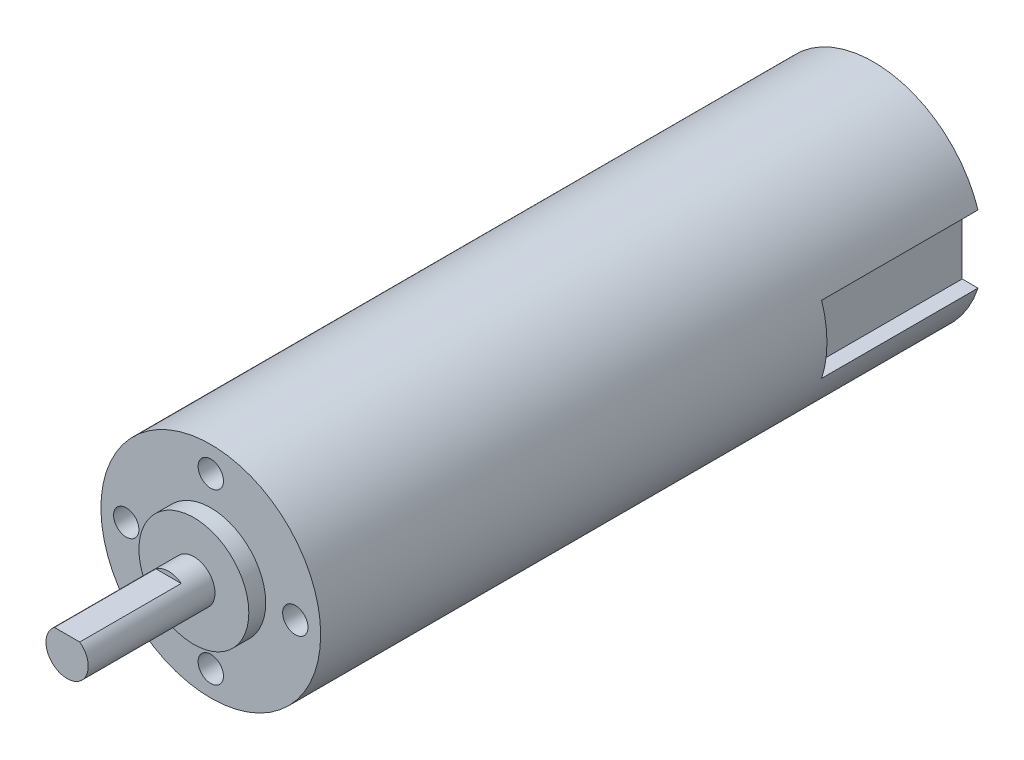
ISO-10303-21;
HEADER;
FILE_DESCRIPTION(('STEP AP214'),'2;1');
FILE_NAME('part.step','',(''),(''),'','','');
FILE_SCHEMA(('AUTOMOTIVE_DESIGN { 1 0 10303 214 1 1 1 1 }'));
ENDSEC;
DATA;
#1=APPLICATION_CONTEXT('core data for automotive mechanical design processes');
#2=APPLICATION_PROTOCOL_DEFINITION('international standard','automotive_design',2000,#1);
#3=PRODUCT_CONTEXT('',#1,'mechanical');
#4=PRODUCT('Part','Part','',(#3));
#5=PRODUCT_RELATED_PRODUCT_CATEGORY('part','',(#4));
#6=PRODUCT_DEFINITION_FORMATION('','',#4);
#7=PRODUCT_DEFINITION_CONTEXT('part definition',#1,'design');
#8=PRODUCT_DEFINITION('design','',#6,#7);
#9=PRODUCT_DEFINITION_SHAPE('','',#8);
#10=(LENGTH_UNIT() NAMED_UNIT(*) SI_UNIT(.MILLI.,.METRE.));
#11=(NAMED_UNIT(*) PLANE_ANGLE_UNIT() SI_UNIT($,.RADIAN.));
#12=(NAMED_UNIT(*) SI_UNIT($,.STERADIAN.) SOLID_ANGLE_UNIT());
#13=UNCERTAINTY_MEASURE_WITH_UNIT(LENGTH_MEASURE(1.E-05),#10,'distance_accuracy_value','');
#14=(GEOMETRIC_REPRESENTATION_CONTEXT(3) GLOBAL_UNCERTAINTY_ASSIGNED_CONTEXT((#13)) GLOBAL_UNIT_ASSIGNED_CONTEXT((#10,
#11,#12)) REPRESENTATION_CONTEXT('',''));
#15=CARTESIAN_POINT('',(0.,0.,0.));
#16=DIRECTION('',(0.,0.,1.));
#17=DIRECTION('',(1.,0.,0.));
#18=AXIS2_PLACEMENT_3D('',#15,#16,#17);
#19=CARTESIAN_POINT('',(0.,0.,78.4));
#20=DIRECTION('',(0.,0.,1.));
#21=DIRECTION('',(1.,0.,0.));
#22=AXIS2_PLACEMENT_3D('',#19,#20,#21);
#23=PLANE('',#22);
#24=CARTESIAN_POINT('',(0.,10.,78.4));
#25=DIRECTION('',(0.,0.,1.));
#26=DIRECTION('',(1.,0.,0.));
#27=AXIS2_PLACEMENT_3D('',#24,#25,#26);
#28=CIRCLE('',#27,1.5);
#29=CARTESIAN_POINT('',(1.5,10.,78.4));
#30=VERTEX_POINT('',#29);
#31=EDGE_CURVE('E142',#30,#30,#28,.T.);
#32=ORIENTED_EDGE('',*,*,#31,.F.);
#33=EDGE_LOOP('',(#32));
#34=FACE_BOUND('',#33,.T.);
#35=CARTESIAN_POINT('',(-10.,0.,78.4));
#36=DIRECTION('',(0.,0.,1.));
#37=DIRECTION('',(1.,0.,0.));
#38=AXIS2_PLACEMENT_3D('',#35,#36,#37);
#39=CIRCLE('',#38,1.5);
#40=CARTESIAN_POINT('',(-8.5,0.,78.4));
#41=VERTEX_POINT('',#40);
#42=EDGE_CURVE('E148',#41,#41,#39,.T.);
#43=ORIENTED_EDGE('',*,*,#42,.F.);
#44=EDGE_LOOP('',(#43));
#45=FACE_BOUND('',#44,.T.);
#46=CARTESIAN_POINT('',(0.,-10.,78.4));
#47=DIRECTION('',(0.,0.,1.));
#48=DIRECTION('',(1.,0.,0.));
#49=AXIS2_PLACEMENT_3D('',#46,#47,#48);
#50=CIRCLE('',#49,1.5);
#51=CARTESIAN_POINT('',(1.5,-10.,78.4));
#52=VERTEX_POINT('',#51);
#53=EDGE_CURVE('E154',#52,#52,#50,.T.);
#54=ORIENTED_EDGE('',*,*,#53,.F.);
#55=EDGE_LOOP('',(#54));
#56=FACE_BOUND('',#55,.T.);
#57=CARTESIAN_POINT('',(10.,0.,78.4));
#58=DIRECTION('',(0.,0.,1.));
#59=DIRECTION('',(1.,0.,0.));
#60=AXIS2_PLACEMENT_3D('',#57,#58,#59);
#61=CIRCLE('',#60,1.5);
#62=CARTESIAN_POINT('',(11.5,0.,78.4));
#63=VERTEX_POINT('',#62);
#64=EDGE_CURVE('E130',#63,#63,#61,.T.);
#65=ORIENTED_EDGE('',*,*,#64,.F.);
#66=EDGE_LOOP('',(#65));
#67=FACE_BOUND('',#66,.T.);
#68=CARTESIAN_POINT('',(0.,0.,78.4));
#69=DIRECTION('',(0.,0.,1.));
#70=DIRECTION('',(1.,0.,0.));
#71=AXIS2_PLACEMENT_3D('',#68,#69,#70);
#72=CIRCLE('',#71,13.);
#73=CARTESIAN_POINT('',(13.,0.,78.4));
#74=VERTEX_POINT('',#73);
#75=EDGE_CURVE('E11',#74,#74,#72,.T.);
#76=ORIENTED_EDGE('',*,*,#75,.T.);
#77=EDGE_LOOP('',(#76));
#78=FACE_BOUND('',#77,.T.);
#79=CARTESIAN_POINT('',(0.,0.,78.4));
#80=DIRECTION('',(0.,0.,1.));
#81=DIRECTION('',(1.,0.,0.));
#82=AXIS2_PLACEMENT_3D('',#79,#80,#81);
#83=CIRCLE('',#82,6.5);
#84=CARTESIAN_POINT('',(6.5,0.,78.4));
#85=VERTEX_POINT('',#84);
#86=EDGE_CURVE('E161',#85,#85,#83,.T.);
#87=ORIENTED_EDGE('',*,*,#86,.F.);
#88=EDGE_LOOP('',(#87));
#89=FACE_BOUND('',#88,.T.);
#90=ADVANCED_FACE('F37',(#34,#45,#56,#67,#78,#89),#23,.T.);
#91=CARTESIAN_POINT('',(0.,0.,78.4));
#92=DIRECTION('',(0.,0.,-1.));
#93=DIRECTION('',(-1.,0.,0.));
#94=AXIS2_PLACEMENT_3D('',#91,#92,#93);
#95=CYLINDRICAL_SURFACE('',#94,13.);
#96=CARTESIAN_POINT('',(0.,0.,18.5));
#97=DIRECTION('',(0.,0.,-1.));
#98=DIRECTION('',(-1.,0.,0.));
#99=AXIS2_PLACEMENT_3D('',#96,#97,#98);
#100=CIRCLE('',#99,13.);
#101=CARTESIAN_POINT('',(12.369316876853,4.,18.5));
#102=VERTEX_POINT('',#101);
#103=CARTESIAN_POINT('',(12.369316876853,-4.,18.5));
#104=VERTEX_POINT('',#103);
#105=EDGE_CURVE('E168',#102,#104,#100,.T.);
#106=ORIENTED_EDGE('',*,*,#105,.F.);
#107=DIRECTION('',(0.,0.,-1.));
#108=VECTOR('',#107,1.);
#109=CARTESIAN_POINT('',(12.369316876853,4.,18.5));
#110=LINE('',#109,#108);
#111=CARTESIAN_POINT('',(12.369316876853,4.,0.));
#112=VERTEX_POINT('',#111);
#113=EDGE_CURVE('E189',#102,#112,#110,.T.);
#114=ORIENTED_EDGE('',*,*,#113,.T.);
#115=CARTESIAN_POINT('',(0.,0.,0.));
#116=DIRECTION('',(0.,0.,1.));
#117=DIRECTION('',(1.,0.,0.));
#118=AXIS2_PLACEMENT_3D('',#115,#116,#117);
#119=CIRCLE('',#118,13.);
#120=CARTESIAN_POINT('',(-12.369316876853,4.,0.));
#121=VERTEX_POINT('',#120);
#122=EDGE_CURVE('E41',#112,#121,#119,.T.);
#123=ORIENTED_EDGE('',*,*,#122,.T.);
#124=DIRECTION('',(0.,0.,-1.));
#125=VECTOR('',#124,1.);
#126=CARTESIAN_POINT('',(-12.369316876853,4.,18.5));
#127=LINE('',#126,#125);
#128=CARTESIAN_POINT('',(-12.369316876853,4.,18.5));
#129=VERTEX_POINT('',#128);
#130=EDGE_CURVE('E216',#129,#121,#127,.T.);
#131=ORIENTED_EDGE('',*,*,#130,.F.);
#132=CARTESIAN_POINT('',(0.,0.,18.5));
#133=DIRECTION('',(0.,0.,-1.));
#134=DIRECTION('',(1.,0.,0.));
#135=AXIS2_PLACEMENT_3D('',#132,#133,#134);
#136=CIRCLE('',#135,13.);
#137=CARTESIAN_POINT('',(-12.3650078174607,-4.01330059603498,18.5));
#138=VERTEX_POINT('',#137);
#139=EDGE_CURVE('E204',#138,#129,#136,.T.);
#140=ORIENTED_EDGE('',*,*,#139,.F.);
#141=DIRECTION('',(0.,0.,-1.));
#142=VECTOR('',#141,1.);
#143=CARTESIAN_POINT('',(-12.3650078174607,-4.01330059603498,18.5));
#144=LINE('',#143,#142);
#145=CARTESIAN_POINT('',(-12.3650078174607,-4.01330059603498,0.));
#146=VERTEX_POINT('',#145);
#147=EDGE_CURVE('E218',#138,#146,#144,.T.);
#148=ORIENTED_EDGE('',*,*,#147,.T.);
#149=CARTESIAN_POINT('',(12.369316876853,-4.,0.));
#150=VERTEX_POINT('',#149);
#151=EDGE_CURVE('E222',#146,#150,#119,.T.);
#152=ORIENTED_EDGE('',*,*,#151,.T.);
#153=DIRECTION('',(0.,0.,-1.));
#154=VECTOR('',#153,1.);
#155=CARTESIAN_POINT('',(12.369316876853,-4.,18.5));
#156=LINE('',#155,#154);
#157=EDGE_CURVE('E180',#104,#150,#156,.T.);
#158=ORIENTED_EDGE('',*,*,#157,.F.);
#159=EDGE_LOOP('',(#106,#114,#123,#131,#140,#148,#152,#158));
#160=FACE_BOUND('',#159,.T.);
#161=ORIENTED_EDGE('',*,*,#75,.F.);
#162=EDGE_LOOP('',(#161));
#163=FACE_BOUND('',#162,.T.);
#164=ADVANCED_FACE('F39',(#160,#163),#95,.T.);
#165=CARTESIAN_POINT('',(0.,0.,0.));
#166=DIRECTION('',(0.,0.,1.));
#167=DIRECTION('',(1.,0.,0.));
#168=AXIS2_PLACEMENT_3D('',#165,#166,#167);
#169=PLANE('',#168);
#170=ORIENTED_EDGE('',*,*,#122,.F.);
#171=DIRECTION('',(1.,0.,0.));
#172=VECTOR('',#171,1.);
#173=CARTESIAN_POINT('',(10.5,4.,0.));
#174=LINE('',#173,#172);
#175=CARTESIAN_POINT('',(10.5,4.,0.));
#176=VERTEX_POINT('',#175);
#177=EDGE_CURVE('E172',#176,#112,#174,.T.);
#178=ORIENTED_EDGE('',*,*,#177,.F.);
#179=DIRECTION('',(0.,1.,0.));
#180=VECTOR('',#179,1.);
#181=CARTESIAN_POINT('',(10.5,0.,0.));
#182=LINE('',#181,#180);
#183=CARTESIAN_POINT('',(10.5,-4.,0.));
#184=VERTEX_POINT('',#183);
#185=EDGE_CURVE('E184',#184,#176,#182,.T.);
#186=ORIENTED_EDGE('',*,*,#185,.F.);
#187=DIRECTION('',(-1.,0.,0.));
#188=VECTOR('',#187,1.);
#189=CARTESIAN_POINT('',(10.5,-4.,0.));
#190=LINE('',#189,#188);
#191=EDGE_CURVE('E181',#150,#184,#190,.T.);
#192=ORIENTED_EDGE('',*,*,#191,.F.);
#193=ORIENTED_EDGE('',*,*,#151,.F.);
#194=DIRECTION('',(-0.999974570704306,-0.00713147563547531,0.));
#195=VECTOR('',#194,1.);
#196=CARTESIAN_POINT('',(-10.5,-4.,0.));
#197=LINE('',#196,#195);
#198=CARTESIAN_POINT('',(-10.5,-4.,0.));
#199=VERTEX_POINT('',#198);
#200=EDGE_CURVE('E165',#199,#146,#197,.T.);
#201=ORIENTED_EDGE('',*,*,#200,.F.);
#202=DIRECTION('',(0.,-1.,0.));
#203=VECTOR('',#202,1.);
#204=CARTESIAN_POINT('',(-10.5,0.,0.));
#205=LINE('',#204,#203);
#206=CARTESIAN_POINT('',(-10.5,4.,0.));
#207=VERTEX_POINT('',#206);
#208=EDGE_CURVE('E201',#207,#199,#205,.T.);
#209=ORIENTED_EDGE('',*,*,#208,.F.);
#210=DIRECTION('',(1.,0.,0.));
#211=VECTOR('',#210,1.);
#212=CARTESIAN_POINT('',(-10.5,4.,0.));
#213=LINE('',#212,#211);
#214=EDGE_CURVE('E211',#121,#207,#213,.T.);
#215=ORIENTED_EDGE('',*,*,#214,.F.);
#216=EDGE_LOOP('',(#170,#178,#186,#192,#193,#201,#209,#215));
#217=FACE_BOUND('',#216,.T.);
#218=ADVANCED_FACE('F237',(#217),#169,.F.);
#219=CARTESIAN_POINT('',(-10.5,0.,18.5));
#220=DIRECTION('',(1.,0.,0.));
#221=DIRECTION('',(0.,0.,-1.));
#222=AXIS2_PLACEMENT_3D('',#219,#220,#221);
#223=PLANE('',#222);
#224=ORIENTED_EDGE('',*,*,#208,.T.);
#225=DIRECTION('',(0.,0.,-1.));
#226=VECTOR('',#225,1.);
#227=CARTESIAN_POINT('',(-10.5,-4.,18.5));
#228=LINE('',#227,#226);
#229=CARTESIAN_POINT('',(-10.5,-4.,18.5));
#230=VERTEX_POINT('',#229);
#231=EDGE_CURVE('E60',#230,#199,#228,.T.);
#232=ORIENTED_EDGE('',*,*,#231,.F.);
#233=DIRECTION('',(0.,-1.,0.));
#234=VECTOR('',#233,1.);
#235=CARTESIAN_POINT('',(-10.5,0.,18.5));
#236=LINE('',#235,#234);
#237=CARTESIAN_POINT('',(-10.5,4.,18.5));
#238=VERTEX_POINT('',#237);
#239=EDGE_CURVE('E197',#238,#230,#236,.T.);
#240=ORIENTED_EDGE('',*,*,#239,.F.);
#241=DIRECTION('',(0.,0.,-1.));
#242=VECTOR('',#241,1.);
#243=CARTESIAN_POINT('',(-10.5,4.,18.5));
#244=LINE('',#243,#242);
#245=EDGE_CURVE('E185',#238,#207,#244,.T.);
#246=ORIENTED_EDGE('',*,*,#245,.T.);
#247=EDGE_LOOP('',(#224,#232,#240,#246));
#248=FACE_BOUND('',#247,.T.);
#249=ADVANCED_FACE('F277',(#248),#223,.F.);
#250=CARTESIAN_POINT('',(-10.5,4.,18.5));
#251=DIRECTION('',(0.,1.,0.));
#252=DIRECTION('',(-1.,0.,0.));
#253=AXIS2_PLACEMENT_3D('',#250,#251,#252);
#254=PLANE('',#253);
#255=ORIENTED_EDGE('',*,*,#214,.T.);
#256=ORIENTED_EDGE('',*,*,#245,.F.);
#257=DIRECTION('',(1.,0.,0.));
#258=VECTOR('',#257,1.);
#259=CARTESIAN_POINT('',(-10.5,4.,18.5));
#260=LINE('',#259,#258);
#261=EDGE_CURVE('E207',#129,#238,#260,.T.);
#262=ORIENTED_EDGE('',*,*,#261,.F.);
#263=ORIENTED_EDGE('',*,*,#130,.T.);
#264=EDGE_LOOP('',(#255,#256,#262,#263));
#265=FACE_BOUND('',#264,.T.);
#266=ADVANCED_FACE('F243',(#265),#254,.F.);
#267=CARTESIAN_POINT('',(-10.5,-4.,18.5));
#268=DIRECTION('',(0.00713147563547531,-0.999974570704306,0.));
#269=DIRECTION('',(0.999974570704306,0.00713147563547531,0.));
#270=AXIS2_PLACEMENT_3D('',#267,#268,#269);
#271=PLANE('',#270);
#272=ORIENTED_EDGE('',*,*,#200,.T.);
#273=ORIENTED_EDGE('',*,*,#147,.F.);
#274=DIRECTION('',(-0.999974570704306,-0.00713147563547531,0.));
#275=VECTOR('',#274,1.);
#276=CARTESIAN_POINT('',(-10.5,-4.,18.5));
#277=LINE('',#276,#275);
#278=EDGE_CURVE('E200',#230,#138,#277,.T.);
#279=ORIENTED_EDGE('',*,*,#278,.F.);
#280=ORIENTED_EDGE('',*,*,#231,.T.);
#281=EDGE_LOOP('',(#272,#273,#279,#280));
#282=FACE_BOUND('',#281,.T.);
#283=ADVANCED_FACE('F286',(#282),#271,.F.);
#284=CARTESIAN_POINT('',(0.,0.,18.5));
#285=DIRECTION('',(0.,0.,1.));
#286=DIRECTION('',(1.,0.,0.));
#287=AXIS2_PLACEMENT_3D('',#284,#285,#286);
#288=PLANE('',#287);
#289=ORIENTED_EDGE('',*,*,#239,.T.);
#290=ORIENTED_EDGE('',*,*,#278,.T.);
#291=ORIENTED_EDGE('',*,*,#139,.T.);
#292=ORIENTED_EDGE('',*,*,#261,.T.);
#293=EDGE_LOOP('',(#289,#290,#291,#292));
#294=FACE_BOUND('',#293,.T.);
#295=ADVANCED_FACE('F245',(#294),#288,.F.);
#296=CARTESIAN_POINT('',(10.5,4.,18.5));
#297=DIRECTION('',(0.,1.,0.));
#298=DIRECTION('',(0.,0.,1.));
#299=AXIS2_PLACEMENT_3D('',#296,#297,#298);
#300=PLANE('',#299);
#301=ORIENTED_EDGE('',*,*,#177,.T.);
#302=ORIENTED_EDGE('',*,*,#113,.F.);
#303=DIRECTION('',(1.,0.,0.));
#304=VECTOR('',#303,1.);
#305=CARTESIAN_POINT('',(10.5,4.,18.5));
#306=LINE('',#305,#304);
#307=CARTESIAN_POINT('',(10.5,4.,18.5));
#308=VERTEX_POINT('',#307);
#309=EDGE_CURVE('E177',#308,#102,#306,.T.);
#310=ORIENTED_EDGE('',*,*,#309,.F.);
#311=DIRECTION('',(0.,0.,-1.));
#312=VECTOR('',#311,1.);
#313=CARTESIAN_POINT('',(10.5,4.,18.5));
#314=LINE('',#313,#312);
#315=EDGE_CURVE('E192',#308,#176,#314,.T.);
#316=ORIENTED_EDGE('',*,*,#315,.T.);
#317=EDGE_LOOP('',(#301,#302,#310,#316));
#318=FACE_BOUND('',#317,.T.);
#319=ADVANCED_FACE('F255',(#318),#300,.F.);
#320=CARTESIAN_POINT('',(10.5,0.,18.5));
#321=DIRECTION('',(-1.,0.,0.));
#322=DIRECTION('',(0.,0.,1.));
#323=AXIS2_PLACEMENT_3D('',#320,#321,#322);
#324=PLANE('',#323);
#325=ORIENTED_EDGE('',*,*,#185,.T.);
#326=ORIENTED_EDGE('',*,*,#315,.F.);
#327=DIRECTION('',(0.,1.,0.));
#328=VECTOR('',#327,1.);
#329=CARTESIAN_POINT('',(10.5,0.,18.5));
#330=LINE('',#329,#328);
#331=CARTESIAN_POINT('',(10.5,-4.,18.5));
#332=VERTEX_POINT('',#331);
#333=EDGE_CURVE('E175',#332,#308,#330,.T.);
#334=ORIENTED_EDGE('',*,*,#333,.F.);
#335=DIRECTION('',(0.,0.,-1.));
#336=VECTOR('',#335,1.);
#337=CARTESIAN_POINT('',(10.5,-4.,18.5));
#338=LINE('',#337,#336);
#339=EDGE_CURVE('E194',#332,#184,#338,.T.);
#340=ORIENTED_EDGE('',*,*,#339,.T.);
#341=EDGE_LOOP('',(#325,#326,#334,#340));
#342=FACE_BOUND('',#341,.T.);
#343=ADVANCED_FACE('F257',(#342),#324,.F.);
#344=CARTESIAN_POINT('',(10.5,-4.,18.5));
#345=DIRECTION('',(0.,-1.,0.));
#346=DIRECTION('',(0.,0.,-1.));
#347=AXIS2_PLACEMENT_3D('',#344,#345,#346);
#348=PLANE('',#347);
#349=ORIENTED_EDGE('',*,*,#191,.T.);
#350=ORIENTED_EDGE('',*,*,#339,.F.);
#351=DIRECTION('',(-1.,0.,0.));
#352=VECTOR('',#351,1.);
#353=CARTESIAN_POINT('',(10.5,-4.,18.5));
#354=LINE('',#353,#352);
#355=EDGE_CURVE('E171',#104,#332,#354,.T.);
#356=ORIENTED_EDGE('',*,*,#355,.F.);
#357=ORIENTED_EDGE('',*,*,#157,.T.);
#358=EDGE_LOOP('',(#349,#350,#356,#357));
#359=FACE_BOUND('',#358,.T.);
#360=ADVANCED_FACE('F248',(#359),#348,.F.);
#361=CARTESIAN_POINT('',(0.,0.,18.5));
#362=DIRECTION('',(0.,0.,-1.));
#363=DIRECTION('',(-1.,0.,0.));
#364=AXIS2_PLACEMENT_3D('',#361,#362,#363);
#365=PLANE('',#364);
#366=ORIENTED_EDGE('',*,*,#105,.T.);
#367=ORIENTED_EDGE('',*,*,#355,.T.);
#368=ORIENTED_EDGE('',*,*,#333,.T.);
#369=ORIENTED_EDGE('',*,*,#309,.T.);
#370=EDGE_LOOP('',(#366,#367,#368,#369));
#371=FACE_BOUND('',#370,.T.);
#372=ADVANCED_FACE('F251',(#371),#365,.T.);
#373=CARTESIAN_POINT('',(0.,0.,80.4));
#374=DIRECTION('',(0.,0.,1.));
#375=DIRECTION('',(1.,0.,0.));
#376=AXIS2_PLACEMENT_3D('',#373,#374,#375);
#377=PLANE('',#376);
#378=CARTESIAN_POINT('',(0.,0.,80.4));
#379=DIRECTION('',(0.,0.,1.));
#380=DIRECTION('',(1.,0.,0.));
#381=AXIS2_PLACEMENT_3D('',#378,#379,#380);
#382=CIRCLE('',#381,6.5);
#383=CARTESIAN_POINT('',(6.5,0.,80.4));
#384=VERTEX_POINT('',#383);
#385=EDGE_CURVE('E162',#384,#384,#382,.T.);
#386=ORIENTED_EDGE('',*,*,#385,.T.);
#387=EDGE_LOOP('',(#386));
#388=FACE_BOUND('',#387,.T.);
#389=CARTESIAN_POINT('',(0.,0.,80.4));
#390=DIRECTION('',(0.,0.,1.));
#391=DIRECTION('',(1.,0.,0.));
#392=AXIS2_PLACEMENT_3D('',#389,#390,#391);
#393=CIRCLE('',#392,2.5);
#394=CARTESIAN_POINT('',(2.5,0.,80.4));
#395=VERTEX_POINT('',#394);
#396=EDGE_CURVE('E141',#395,#395,#393,.T.);
#397=ORIENTED_EDGE('',*,*,#396,.F.);
#398=EDGE_LOOP('',(#397));
#399=FACE_BOUND('',#398,.T.);
#400=ADVANCED_FACE('F299',(#388,#399),#377,.T.);
#401=CARTESIAN_POINT('',(0.,0.,80.4));
#402=DIRECTION('',(0.,0.,-1.));
#403=DIRECTION('',(-1.,0.,0.));
#404=AXIS2_PLACEMENT_3D('',#401,#402,#403);
#405=CYLINDRICAL_SURFACE('',#404,6.5);
#406=ORIENTED_EDGE('',*,*,#385,.F.);
#407=EDGE_LOOP('',(#406));
#408=FACE_BOUND('',#407,.T.);
#409=ORIENTED_EDGE('',*,*,#86,.T.);
#410=EDGE_LOOP('',(#409));
#411=FACE_BOUND('',#410,.T.);
#412=ADVANCED_FACE('F293',(#408,#411),#405,.T.);
#413=CARTESIAN_POINT('',(0.,0.,95.4));
#414=DIRECTION('',(0.,0.,1.));
#415=DIRECTION('',(1.,0.,0.));
#416=AXIS2_PLACEMENT_3D('',#413,#414,#415);
#417=PLANE('',#416);
#418=DIRECTION('',(1.,0.,0.));
#419=VECTOR('',#418,1.);
#420=CARTESIAN_POINT('',(0.,2.,95.4));
#421=LINE('',#420,#419);
#422=CARTESIAN_POINT('',(-1.5,2.,95.4));
#423=VERTEX_POINT('',#422);
#424=CARTESIAN_POINT('',(1.5,2.,95.4));
#425=VERTEX_POINT('',#424);
#426=EDGE_CURVE('E120',#423,#425,#421,.T.);
#427=ORIENTED_EDGE('',*,*,#426,.F.);
#428=CARTESIAN_POINT('',(0.,0.,95.4));
#429=DIRECTION('',(0.,0.,1.));
#430=DIRECTION('',(1.,0.,0.));
#431=AXIS2_PLACEMENT_3D('',#428,#429,#430);
#432=CIRCLE('',#431,2.5);
#433=EDGE_CURVE('E129',#423,#425,#432,.T.);
#434=ORIENTED_EDGE('',*,*,#433,.T.);
#435=EDGE_LOOP('',(#427,#434));
#436=FACE_BOUND('',#435,.T.);
#437=ADVANCED_FACE('F291',(#436),#417,.T.);
#438=CARTESIAN_POINT('',(0.,0.,95.4));
#439=DIRECTION('',(0.,0.,-1.));
#440=DIRECTION('',(-1.,0.,0.));
#441=AXIS2_PLACEMENT_3D('',#438,#439,#440);
#442=CYLINDRICAL_SURFACE('',#441,2.5);
#443=ORIENTED_EDGE('',*,*,#433,.F.);
#444=DIRECTION('',(0.,0.,1.));
#445=VECTOR('',#444,1.);
#446=CARTESIAN_POINT('',(-1.5,2.,83.4));
#447=LINE('',#446,#445);
#448=CARTESIAN_POINT('',(-1.5,2.,83.4));
#449=VERTEX_POINT('',#448);
#450=EDGE_CURVE('E115',#449,#423,#447,.T.);
#451=ORIENTED_EDGE('',*,*,#450,.F.);
#452=CARTESIAN_POINT('',(0.,0.,83.4));
#453=DIRECTION('',(0.,0.,1.));
#454=DIRECTION('',(-1.,0.,0.));
#455=AXIS2_PLACEMENT_3D('',#452,#453,#454);
#456=CIRCLE('',#455,2.5);
#457=CARTESIAN_POINT('',(1.5,2.,83.4));
#458=VERTEX_POINT('',#457);
#459=EDGE_CURVE('E119',#458,#449,#456,.T.);
#460=ORIENTED_EDGE('',*,*,#459,.F.);
#461=DIRECTION('',(0.,0.,1.));
#462=VECTOR('',#461,1.);
#463=CARTESIAN_POINT('',(1.5,2.,83.4));
#464=LINE('',#463,#462);
#465=EDGE_CURVE('E52',#458,#425,#464,.T.);
#466=ORIENTED_EDGE('',*,*,#465,.T.);
#467=EDGE_LOOP('',(#443,#451,#460,#466));
#468=FACE_BOUND('',#467,.T.);
#469=ORIENTED_EDGE('',*,*,#396,.T.);
#470=EDGE_LOOP('',(#469));
#471=FACE_BOUND('',#470,.T.);
#472=ADVANCED_FACE('F126',(#468,#471),#442,.T.);
#473=CARTESIAN_POINT('',(10.,0.,74.4));
#474=DIRECTION('',(0.,0.,1.));
#475=DIRECTION('',(1.,0.,0.));
#476=AXIS2_PLACEMENT_3D('',#473,#474,#475);
#477=CYLINDRICAL_SURFACE('',#476,1.5);
#478=CARTESIAN_POINT('',(10.,0.,74.4));
#479=DIRECTION('',(0.,0.,1.));
#480=DIRECTION('',(1.,0.,0.));
#481=AXIS2_PLACEMENT_3D('',#478,#479,#480);
#482=CIRCLE('',#481,1.5);
#483=CARTESIAN_POINT('',(11.5,0.,74.4));
#484=VERTEX_POINT('',#483);
#485=EDGE_CURVE('E133',#484,#484,#482,.T.);
#486=ORIENTED_EDGE('',*,*,#485,.F.);
#487=EDGE_LOOP('',(#486));
#488=FACE_BOUND('',#487,.T.);
#489=ORIENTED_EDGE('',*,*,#64,.T.);
#490=EDGE_LOOP('',(#489));
#491=FACE_BOUND('',#490,.T.);
#492=ADVANCED_FACE('F298',(#488,#491),#477,.F.);
#493=CARTESIAN_POINT('',(10.,0.,74.4));
#494=DIRECTION('',(0.,0.,1.));
#495=DIRECTION('',(1.,0.,0.));
#496=AXIS2_PLACEMENT_3D('',#493,#494,#495);
#497=PLANE('',#496);
#498=ORIENTED_EDGE('',*,*,#485,.T.);
#499=EDGE_LOOP('',(#498));
#500=FACE_BOUND('',#499,.T.);
#501=ADVANCED_FACE('F337',(#500),#497,.T.);
#502=CARTESIAN_POINT('',(0.,-10.,74.4));
#503=DIRECTION('',(0.,0.,1.));
#504=DIRECTION('',(1.,0.,0.));
#505=AXIS2_PLACEMENT_3D('',#502,#503,#504);
#506=CYLINDRICAL_SURFACE('',#505,1.5);
#507=CARTESIAN_POINT('',(0.,-10.,74.4));
#508=DIRECTION('',(0.,0.,1.));
#509=DIRECTION('',(1.,0.,0.));
#510=AXIS2_PLACEMENT_3D('',#507,#508,#509);
#511=CIRCLE('',#510,1.5);
#512=CARTESIAN_POINT('',(1.5,-10.,74.4));
#513=VERTEX_POINT('',#512);
#514=EDGE_CURVE('E151',#513,#513,#511,.T.);
#515=ORIENTED_EDGE('',*,*,#514,.F.);
#516=EDGE_LOOP('',(#515));
#517=FACE_BOUND('',#516,.T.);
#518=ORIENTED_EDGE('',*,*,#53,.T.);
#519=EDGE_LOOP('',(#518));
#520=FACE_BOUND('',#519,.T.);
#521=ADVANCED_FACE('F346',(#517,#520),#506,.F.);
#522=CARTESIAN_POINT('',(0.,-10.,74.4));
#523=DIRECTION('',(0.,0.,1.));
#524=DIRECTION('',(1.,0.,0.));
#525=AXIS2_PLACEMENT_3D('',#522,#523,#524);
#526=PLANE('',#525);
#527=ORIENTED_EDGE('',*,*,#514,.T.);
#528=EDGE_LOOP('',(#527));
#529=FACE_BOUND('',#528,.T.);
#530=ADVANCED_FACE('F356',(#529),#526,.T.);
#531=CARTESIAN_POINT('',(-10.,0.,74.4));
#532=DIRECTION('',(0.,0.,1.));
#533=DIRECTION('',(1.,0.,0.));
#534=AXIS2_PLACEMENT_3D('',#531,#532,#533);
#535=CYLINDRICAL_SURFACE('',#534,1.5);
#536=CARTESIAN_POINT('',(-10.,0.,74.4));
#537=DIRECTION('',(0.,0.,1.));
#538=DIRECTION('',(1.,0.,0.));
#539=AXIS2_PLACEMENT_3D('',#536,#537,#538);
#540=CIRCLE('',#539,1.5);
#541=CARTESIAN_POINT('',(-8.5,0.,74.4));
#542=VERTEX_POINT('',#541);
#543=EDGE_CURVE('E145',#542,#542,#540,.T.);
#544=ORIENTED_EDGE('',*,*,#543,.F.);
#545=EDGE_LOOP('',(#544));
#546=FACE_BOUND('',#545,.T.);
#547=ORIENTED_EDGE('',*,*,#42,.T.);
#548=EDGE_LOOP('',(#547));
#549=FACE_BOUND('',#548,.T.);
#550=ADVANCED_FACE('F366',(#546,#549),#535,.F.);
#551=CARTESIAN_POINT('',(-10.,0.,74.4));
#552=DIRECTION('',(0.,0.,1.));
#553=DIRECTION('',(1.,0.,0.));
#554=AXIS2_PLACEMENT_3D('',#551,#552,#553);
#555=PLANE('',#554);
#556=ORIENTED_EDGE('',*,*,#543,.T.);
#557=EDGE_LOOP('',(#556));
#558=FACE_BOUND('',#557,.T.);
#559=ADVANCED_FACE('F376',(#558),#555,.T.);
#560=CARTESIAN_POINT('',(0.,10.,74.4));
#561=DIRECTION('',(0.,0.,1.));
#562=DIRECTION('',(1.,0.,0.));
#563=AXIS2_PLACEMENT_3D('',#560,#561,#562);
#564=CYLINDRICAL_SURFACE('',#563,1.5);
#565=CARTESIAN_POINT('',(0.,10.,74.4));
#566=DIRECTION('',(0.,0.,1.));
#567=DIRECTION('',(1.,0.,0.));
#568=AXIS2_PLACEMENT_3D('',#565,#566,#567);
#569=CIRCLE('',#568,1.5);
#570=CARTESIAN_POINT('',(1.5,10.,74.4));
#571=VERTEX_POINT('',#570);
#572=EDGE_CURVE('E138',#571,#571,#569,.T.);
#573=ORIENTED_EDGE('',*,*,#572,.F.);
#574=EDGE_LOOP('',(#573));
#575=FACE_BOUND('',#574,.T.);
#576=ORIENTED_EDGE('',*,*,#31,.T.);
#577=EDGE_LOOP('',(#576));
#578=FACE_BOUND('',#577,.T.);
#579=ADVANCED_FACE('F386',(#575,#578),#564,.F.);
#580=CARTESIAN_POINT('',(0.,10.,74.4));
#581=DIRECTION('',(0.,0.,1.));
#582=DIRECTION('',(1.,0.,0.));
#583=AXIS2_PLACEMENT_3D('',#580,#581,#582);
#584=PLANE('',#583);
#585=ORIENTED_EDGE('',*,*,#572,.T.);
#586=EDGE_LOOP('',(#585));
#587=FACE_BOUND('',#586,.T.);
#588=ADVANCED_FACE('F396',(#587),#584,.T.);
#589=CARTESIAN_POINT('',(0.,2.,83.4));
#590=DIRECTION('',(0.,-1.,0.));
#591=DIRECTION('',(0.,0.,-1.));
#592=AXIS2_PLACEMENT_3D('',#589,#590,#591);
#593=PLANE('',#592);
#594=ORIENTED_EDGE('',*,*,#426,.T.);
#595=ORIENTED_EDGE('',*,*,#465,.F.);
#596=DIRECTION('',(1.,0.,0.));
#597=VECTOR('',#596,1.);
#598=CARTESIAN_POINT('',(0.,2.,83.4));
#599=LINE('',#598,#597);
#600=EDGE_CURVE('E111',#449,#458,#599,.T.);
#601=ORIENTED_EDGE('',*,*,#600,.F.);
#602=ORIENTED_EDGE('',*,*,#450,.T.);
#603=EDGE_LOOP('',(#594,#595,#601,#602));
#604=FACE_BOUND('',#603,.T.);
#605=ADVANCED_FACE('F113',(#604),#593,.F.);
#606=CARTESIAN_POINT('',(0.,0.,83.4));
#607=DIRECTION('',(0.,0.,-1.));
#608=DIRECTION('',(-1.,0.,0.));
#609=AXIS2_PLACEMENT_3D('',#606,#607,#608);
#610=PLANE('',#609);
#611=ORIENTED_EDGE('',*,*,#600,.T.);
#612=ORIENTED_EDGE('',*,*,#459,.T.);
#613=EDGE_LOOP('',(#611,#612));
#614=FACE_BOUND('',#613,.T.);
#615=ADVANCED_FACE('F122',(#614),#610,.F.);
#616=CLOSED_SHELL('',(#90,#164,#218,#249,#266,#283,#295,#319,#343,#360,#372,#400,#412,#437,#472,
#492,#501,#521,#530,#550,#559,#579,#588,#605,#615));
#617=MANIFOLD_SOLID_BREP('B2',#616);
#618=ADVANCED_BREP_SHAPE_REPRESENTATION('',(#18,#617),#14);
#619=SHAPE_DEFINITION_REPRESENTATION(#9,#618);
ENDSEC;
END-ISO-10303-21;
